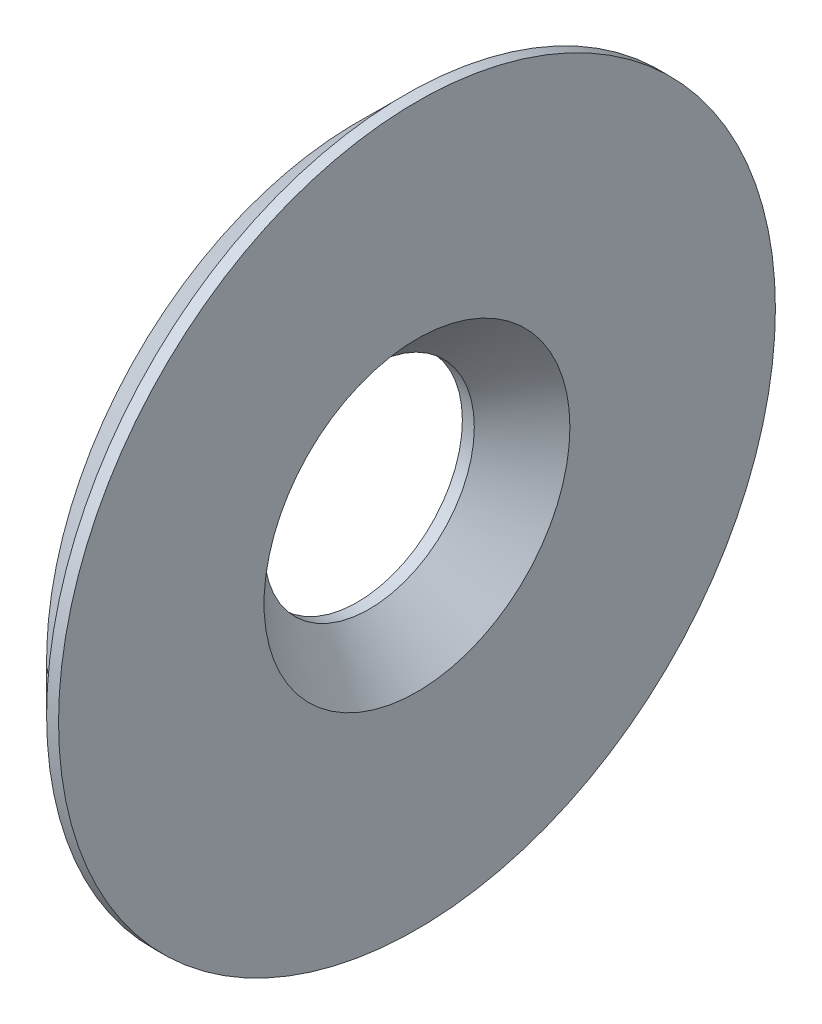
ISO-10303-21;
HEADER;
FILE_DESCRIPTION(('STEP AP214'),'2;1');
FILE_NAME('part.step','',(''),(''),'','','');
FILE_SCHEMA(('AUTOMOTIVE_DESIGN { 1 0 10303 214 1 1 1 1 }'));
ENDSEC;
DATA;
#1=APPLICATION_CONTEXT('core data for automotive mechanical design processes');
#2=APPLICATION_PROTOCOL_DEFINITION('international standard','automotive_design',2000,#1);
#3=PRODUCT_CONTEXT('',#1,'mechanical');
#4=PRODUCT('Part','Part','',(#3));
#5=PRODUCT_RELATED_PRODUCT_CATEGORY('part','',(#4));
#6=PRODUCT_DEFINITION_FORMATION('','',#4);
#7=PRODUCT_DEFINITION_CONTEXT('part definition',#1,'design');
#8=PRODUCT_DEFINITION('design','',#6,#7);
#9=PRODUCT_DEFINITION_SHAPE('','',#8);
#10=(LENGTH_UNIT() NAMED_UNIT(*) SI_UNIT(.MILLI.,.METRE.));
#11=(NAMED_UNIT(*) PLANE_ANGLE_UNIT() SI_UNIT($,.RADIAN.));
#12=(NAMED_UNIT(*) SI_UNIT($,.STERADIAN.) SOLID_ANGLE_UNIT());
#13=UNCERTAINTY_MEASURE_WITH_UNIT(LENGTH_MEASURE(1.E-05),#10,'distance_accuracy_value','');
#14=(GEOMETRIC_REPRESENTATION_CONTEXT(3) GLOBAL_UNCERTAINTY_ASSIGNED_CONTEXT((#13)) GLOBAL_UNIT_ASSIGNED_CONTEXT((#10,
#11,#12)) REPRESENTATION_CONTEXT('',''));
#15=CARTESIAN_POINT('',(0.,0.,0.));
#16=DIRECTION('',(0.,0.,1.));
#17=DIRECTION('',(1.,0.,0.));
#18=AXIS2_PLACEMENT_3D('',#15,#16,#17);
#19=CARTESIAN_POINT('',(2.5,0.,0.));
#20=DIRECTION('',(1.,0.,0.));
#21=DIRECTION('',(0.,0.,-1.));
#22=AXIS2_PLACEMENT_3D('',#19,#20,#21);
#23=PLANE('',#22);
#24=CARTESIAN_POINT('',(2.5,0.,0.));
#25=DIRECTION('',(1.,0.,0.));
#26=DIRECTION('',(0.,0.,-1.));
#27=AXIS2_PLACEMENT_3D('',#24,#25,#26);
#28=CIRCLE('',#27,6.4);
#29=CARTESIAN_POINT('',(2.5,0.,-6.4));
#30=VERTEX_POINT('',#29);
#31=EDGE_CURVE('E10',#30,#30,#28,.F.);
#32=ORIENTED_EDGE('',*,*,#31,.T.);
#33=EDGE_LOOP('',(#32));
#34=FACE_BOUND('',#33,.T.);
#35=CARTESIAN_POINT('',(2.5,0.,0.));
#36=DIRECTION('',(1.,0.,0.));
#37=DIRECTION('',(0.,0.,-1.));
#38=AXIS2_PLACEMENT_3D('',#35,#36,#37);
#39=CIRCLE('',#38,15.);
#40=CARTESIAN_POINT('',(2.5,0.,-15.));
#41=VERTEX_POINT('',#40);
#42=EDGE_CURVE('E51',#41,#41,#39,.T.);
#43=ORIENTED_EDGE('',*,*,#42,.T.);
#44=EDGE_LOOP('',(#43));
#45=FACE_BOUND('',#44,.T.);
#46=ADVANCED_FACE('F31',(#34,#45),#23,.T.);
#47=CARTESIAN_POINT('',(0.,0.,0.));
#48=DIRECTION('',(1.,0.,0.));
#49=DIRECTION('',(0.,0.,-1.));
#50=AXIS2_PLACEMENT_3D('',#47,#48,#49);
#51=PLANE('',#50);
#52=CARTESIAN_POINT('',(0.,0.,0.));
#53=DIRECTION('',(1.,0.,0.));
#54=DIRECTION('',(0.,0.,-1.));
#55=AXIS2_PLACEMENT_3D('',#52,#53,#54);
#56=CIRCLE('',#55,13.);
#57=CARTESIAN_POINT('',(0.,0.,-13.));
#58=VERTEX_POINT('',#57);
#59=EDGE_CURVE('E42',#58,#58,#56,.F.);
#60=ORIENTED_EDGE('',*,*,#59,.T.);
#61=EDGE_LOOP('',(#60));
#62=FACE_BOUND('',#61,.T.);
#63=CARTESIAN_POINT('',(0.,0.,0.));
#64=DIRECTION('',(1.,0.,0.));
#65=DIRECTION('',(0.,0.,-1.));
#66=AXIS2_PLACEMENT_3D('',#63,#64,#65);
#67=CIRCLE('',#66,4.4);
#68=CARTESIAN_POINT('',(0.,0.,-4.4));
#69=VERTEX_POINT('',#68);
#70=EDGE_CURVE('E54',#69,#69,#67,.T.);
#71=ORIENTED_EDGE('',*,*,#70,.T.);
#72=EDGE_LOOP('',(#71));
#73=FACE_BOUND('',#72,.T.);
#74=ADVANCED_FACE('F58',(#62,#73),#51,.F.);
#75=CARTESIAN_POINT('',(2.5,0.,0.));
#76=DIRECTION('',(-1.,0.,0.));
#77=DIRECTION('',(0.,0.,1.));
#78=AXIS2_PLACEMENT_3D('',#75,#76,#77);
#79=CYLINDRICAL_SURFACE('',#78,15.);
#80=CARTESIAN_POINT('',(2.,0.,0.));
#81=DIRECTION('',(1.,0.,0.));
#82=DIRECTION('',(0.,0.,-1.));
#83=AXIS2_PLACEMENT_3D('',#80,#81,#82);
#84=CIRCLE('',#83,15.);
#85=CARTESIAN_POINT('',(2.,0.,-15.));
#86=VERTEX_POINT('',#85);
#87=EDGE_CURVE('E46',#86,#86,#84,.T.);
#88=ORIENTED_EDGE('',*,*,#87,.T.);
#89=EDGE_LOOP('',(#88));
#90=FACE_BOUND('',#89,.T.);
#91=ORIENTED_EDGE('',*,*,#42,.F.);
#92=EDGE_LOOP('',(#91));
#93=FACE_BOUND('',#92,.T.);
#94=ADVANCED_FACE('F63',(#90,#93),#79,.T.);
#95=CARTESIAN_POINT('',(2.5,0.,0.));
#96=DIRECTION('',(-1.,0.,0.));
#97=DIRECTION('',(0.,0.,1.));
#98=AXIS2_PLACEMENT_3D('',#95,#96,#97);
#99=CYLINDRICAL_SURFACE('',#98,4.4);
#100=CARTESIAN_POINT('',(0.50000000000001,0.,0.));
#101=DIRECTION('',(1.,0.,0.));
#102=DIRECTION('',(0.,0.,-1.));
#103=AXIS2_PLACEMENT_3D('',#100,#101,#102);
#104=CIRCLE('',#103,4.4);
#105=CARTESIAN_POINT('',(0.50000000000001,0.,-4.4));
#106=VERTEX_POINT('',#105);
#107=EDGE_CURVE('E38',#106,#106,#104,.T.);
#108=ORIENTED_EDGE('',*,*,#107,.T.);
#109=EDGE_LOOP('',(#108));
#110=FACE_BOUND('',#109,.T.);
#111=ORIENTED_EDGE('',*,*,#70,.F.);
#112=EDGE_LOOP('',(#111));
#113=FACE_BOUND('',#112,.T.);
#114=ADVANCED_FACE('F60',(#110,#113),#99,.F.);
#115=CARTESIAN_POINT('',(2.,0.,0.));
#116=DIRECTION('',(1.,0.,0.));
#117=DIRECTION('',(0.,0.,-1.));
#118=AXIS2_PLACEMENT_3D('',#115,#116,#117);
#119=CONICAL_SURFACE('',#118,15.,0.78539816339745);
#120=ORIENTED_EDGE('',*,*,#59,.F.);
#121=EDGE_LOOP('',(#120));
#122=FACE_BOUND('',#121,.T.);
#123=ORIENTED_EDGE('',*,*,#87,.F.);
#124=EDGE_LOOP('',(#123));
#125=FACE_BOUND('',#124,.T.);
#126=ADVANCED_FACE('F62',(#122,#125),#119,.T.);
#127=CARTESIAN_POINT('',(0.50000000000001,0.,0.));
#128=DIRECTION('',(1.,0.,0.));
#129=DIRECTION('',(0.,0.,-1.));
#130=AXIS2_PLACEMENT_3D('',#127,#128,#129);
#131=CONICAL_SURFACE('',#130,4.4,0.785398163397451);
#132=ORIENTED_EDGE('',*,*,#31,.F.);
#133=EDGE_LOOP('',(#132));
#134=FACE_BOUND('',#133,.T.);
#135=ORIENTED_EDGE('',*,*,#107,.F.);
#136=EDGE_LOOP('',(#135));
#137=FACE_BOUND('',#136,.T.);
#138=ADVANCED_FACE('F33',(#134,#137),#131,.F.);
#139=CLOSED_SHELL('',(#46,#74,#94,#114,#126,#138));
#140=MANIFOLD_SOLID_BREP('B2',#139);
#141=ADVANCED_BREP_SHAPE_REPRESENTATION('',(#18,#140),#14);
#142=SHAPE_DEFINITION_REPRESENTATION(#9,#141);
ENDSEC;
END-ISO-10303-21;
